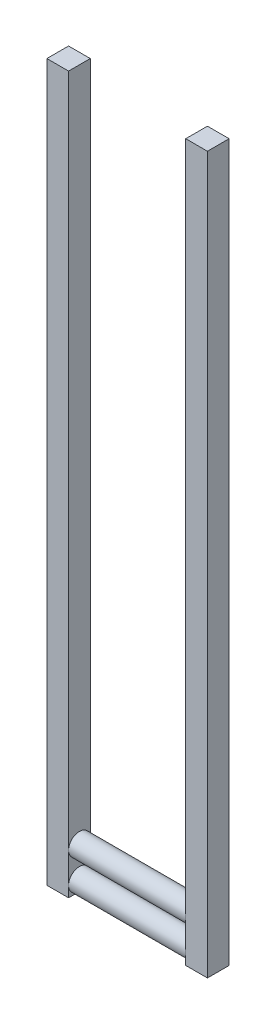
ISO-10303-21;
HEADER;
FILE_DESCRIPTION(('STEP AP214'),'2;1');
FILE_NAME('part.step','',(''),(''),'','','');
FILE_SCHEMA(('AUTOMOTIVE_DESIGN { 1 0 10303 214 1 1 1 1 }'));
ENDSEC;
DATA;
#1=APPLICATION_CONTEXT('core data for automotive mechanical design processes');
#2=APPLICATION_PROTOCOL_DEFINITION('international standard','automotive_design',2000,#1);
#3=PRODUCT_CONTEXT('',#1,'mechanical');
#4=PRODUCT('Part','Part','',(#3));
#5=PRODUCT_RELATED_PRODUCT_CATEGORY('part','',(#4));
#6=PRODUCT_DEFINITION_FORMATION('','',#4);
#7=PRODUCT_DEFINITION_CONTEXT('part definition',#1,'design');
#8=PRODUCT_DEFINITION('design','',#6,#7);
#9=PRODUCT_DEFINITION_SHAPE('','',#8);
#10=(LENGTH_UNIT() NAMED_UNIT(*) SI_UNIT(.MILLI.,.METRE.));
#11=(NAMED_UNIT(*) PLANE_ANGLE_UNIT() SI_UNIT($,.RADIAN.));
#12=(NAMED_UNIT(*) SI_UNIT($,.STERADIAN.) SOLID_ANGLE_UNIT());
#13=UNCERTAINTY_MEASURE_WITH_UNIT(LENGTH_MEASURE(1.E-05),#10,'distance_accuracy_value','');
#14=(GEOMETRIC_REPRESENTATION_CONTEXT(3) GLOBAL_UNCERTAINTY_ASSIGNED_CONTEXT((#13)) GLOBAL_UNIT_ASSIGNED_CONTEXT((#10,
#11,#12)) REPRESENTATION_CONTEXT('',''));
#15=CARTESIAN_POINT('',(0.,0.,0.));
#16=DIRECTION('',(0.,0.,1.));
#17=DIRECTION('',(1.,0.,0.));
#18=AXIS2_PLACEMENT_3D('',#15,#16,#17);
#19=CARTESIAN_POINT('',(-15.5357142857143,-165.,0.));
#20=DIRECTION('',(1.,0.,0.));
#21=DIRECTION('',(0.,0.,-1.));
#22=AXIS2_PLACEMENT_3D('',#19,#20,#21);
#23=PLANE('',#22);
#24=DIRECTION('',(0.,1.,0.));
#25=VECTOR('',#24,1.);
#26=CARTESIAN_POINT('',(-15.5357142857143,-165.,-5.));
#27=LINE('',#26,#25);
#28=CARTESIAN_POINT('',(-15.5357142857143,-162.5,-5.));
#29=VERTEX_POINT('',#28);
#30=CARTESIAN_POINT('',(-15.5357142857143,-155.5,-5.));
#31=VERTEX_POINT('',#30);
#32=EDGE_CURVE('E221',#29,#31,#27,.T.);
#33=ORIENTED_EDGE('',*,*,#32,.T.);
#34=CARTESIAN_POINT('',(-15.5357142857143,-155.5,-2.5));
#35=DIRECTION('',(1.,0.,0.));
#36=DIRECTION('',(0.,0.,-1.));
#37=AXIS2_PLACEMENT_3D('',#34,#35,#36);
#38=CIRCLE('',#37,2.5);
#39=CARTESIAN_POINT('',(-15.5357142857143,-155.5,0.));
#40=VERTEX_POINT('',#39);
#41=EDGE_CURVE('E55',#40,#31,#38,.T.);
#42=ORIENTED_EDGE('',*,*,#41,.F.);
#43=DIRECTION('',(0.,1.,0.));
#44=VECTOR('',#43,1.);
#45=CARTESIAN_POINT('',(-15.5357142857143,-165.,0.));
#46=LINE('',#45,#44);
#47=CARTESIAN_POINT('',(-15.5357142857143,-162.5,0.));
#48=VERTEX_POINT('',#47);
#49=EDGE_CURVE('E225',#48,#40,#46,.T.);
#50=ORIENTED_EDGE('',*,*,#49,.F.);
#51=CARTESIAN_POINT('',(-15.5357142857143,-162.5,-2.5));
#52=DIRECTION('',(1.,0.,0.));
#53=DIRECTION('',(0.,0.,-1.));
#54=AXIS2_PLACEMENT_3D('',#51,#52,#53);
#55=CIRCLE('',#54,2.5);
#56=EDGE_CURVE('E49',#29,#48,#55,.T.);
#57=ORIENTED_EDGE('',*,*,#56,.F.);
#58=EDGE_LOOP('',(#33,#42,#50,#57));
#59=FACE_BOUND('',#58,.T.);
#60=ADVANCED_FACE('F38',(#59),#23,.T.);
#61=CARTESIAN_POINT('',(11.4642857142857,-165.,0.));
#62=DIRECTION('',(-1.,0.,0.));
#63=DIRECTION('',(0.,0.,1.));
#64=AXIS2_PLACEMENT_3D('',#61,#62,#63);
#65=PLANE('',#64);
#66=DIRECTION('',(0.,1.,0.));
#67=VECTOR('',#66,1.);
#68=CARTESIAN_POINT('',(11.4642857142857,-165.,0.));
#69=LINE('',#68,#67);
#70=CARTESIAN_POINT('',(11.4642857142857,-162.5,0.));
#71=VERTEX_POINT('',#70);
#72=CARTESIAN_POINT('',(11.4642857142857,-155.5,0.));
#73=VERTEX_POINT('',#72);
#74=EDGE_CURVE('E148',#71,#73,#69,.T.);
#75=ORIENTED_EDGE('',*,*,#74,.T.);
#76=CARTESIAN_POINT('',(11.4642857142857,-155.5,-2.49999999999999));
#77=DIRECTION('',(1.,0.,0.));
#78=DIRECTION('',(0.,0.,-1.));
#79=AXIS2_PLACEMENT_3D('',#76,#77,#78);
#80=CIRCLE('',#79,2.5);
#81=CARTESIAN_POINT('',(11.4642857142857,-155.5,-5.));
#82=VERTEX_POINT('',#81);
#83=EDGE_CURVE('E62',#73,#82,#80,.T.);
#84=ORIENTED_EDGE('',*,*,#83,.T.);
#85=DIRECTION('',(0.,1.,0.));
#86=VECTOR('',#85,1.);
#87=CARTESIAN_POINT('',(11.4642857142857,-165.,-5.));
#88=LINE('',#87,#86);
#89=CARTESIAN_POINT('',(11.4642857142857,-162.5,-5.));
#90=VERTEX_POINT('',#89);
#91=EDGE_CURVE('E145',#90,#82,#88,.T.);
#92=ORIENTED_EDGE('',*,*,#91,.F.);
#93=CARTESIAN_POINT('',(11.4642857142857,-162.5,-2.49999999999999));
#94=DIRECTION('',(1.,0.,0.));
#95=DIRECTION('',(0.,0.,-1.));
#96=AXIS2_PLACEMENT_3D('',#93,#94,#95);
#97=CIRCLE('',#96,2.5);
#98=EDGE_CURVE('E188',#90,#71,#97,.T.);
#99=ORIENTED_EDGE('',*,*,#98,.T.);
#100=EDGE_LOOP('',(#75,#84,#92,#99));
#101=FACE_BOUND('',#100,.T.);
#102=ADVANCED_FACE('F142',(#101),#65,.T.);
#103=CARTESIAN_POINT('',(-15.5357142857143,0.,0.));
#104=VERTEX_POINT('',#103);
#105=EDGE_CURVE('E226',#40,#104,#46,.T.);
#106=ORIENTED_EDGE('',*,*,#105,.F.);
#107=EDGE_CURVE('E157',#31,#40,#38,.T.);
#108=ORIENTED_EDGE('',*,*,#107,.F.);
#109=CARTESIAN_POINT('',(-15.5357142857143,0.,-5.));
#110=VERTEX_POINT('',#109);
#111=EDGE_CURVE('E222',#31,#110,#27,.T.);
#112=ORIENTED_EDGE('',*,*,#111,.T.);
#113=DIRECTION('',(0.,0.,-1.));
#114=VECTOR('',#113,1.);
#115=CARTESIAN_POINT('',(-15.5357142857143,0.,0.));
#116=LINE('',#115,#114);
#117=EDGE_CURVE('E213',#104,#110,#116,.T.);
#118=ORIENTED_EDGE('',*,*,#117,.F.);
#119=EDGE_LOOP('',(#106,#108,#112,#118));
#120=FACE_BOUND('',#119,.T.);
#121=ADVANCED_FACE('F261',(#120),#23,.T.);
#122=CARTESIAN_POINT('',(-15.5357142857143,-165.,-2.5));
#123=VERTEX_POINT('',#122);
#124=EDGE_CURVE('E11',#48,#123,#55,.T.);
#125=ORIENTED_EDGE('',*,*,#124,.F.);
#126=CARTESIAN_POINT('',(-15.5357142857143,-165.,0.));
#127=VERTEX_POINT('',#126);
#128=EDGE_CURVE('E223',#127,#48,#46,.T.);
#129=ORIENTED_EDGE('',*,*,#128,.F.);
#130=DIRECTION('',(0.,0.,-1.));
#131=VECTOR('',#130,1.);
#132=CARTESIAN_POINT('',(-15.5357142857143,-165.,0.));
#133=LINE('',#132,#131);
#134=EDGE_CURVE('E202',#127,#123,#133,.T.);
#135=ORIENTED_EDGE('',*,*,#134,.T.);
#136=EDGE_LOOP('',(#125,#129,#135));
#137=FACE_BOUND('',#136,.T.);
#138=ADVANCED_FACE('F252',(#137),#23,.T.);
#139=CARTESIAN_POINT('',(-20.5357142857143,-165.,0.));
#140=DIRECTION('',(-1.,0.,0.));
#141=DIRECTION('',(0.,0.,1.));
#142=AXIS2_PLACEMENT_3D('',#139,#140,#141);
#143=PLANE('',#142);
#144=DIRECTION('',(0.,0.,1.));
#145=VECTOR('',#144,1.);
#146=CARTESIAN_POINT('',(-20.5357142857143,0.,0.));
#147=LINE('',#146,#145);
#148=CARTESIAN_POINT('',(-20.5357142857143,0.,-5.));
#149=VERTEX_POINT('',#148);
#150=CARTESIAN_POINT('',(-20.5357142857143,0.,0.));
#151=VERTEX_POINT('',#150);
#152=EDGE_CURVE('E189',#149,#151,#147,.T.);
#153=ORIENTED_EDGE('',*,*,#152,.F.);
#154=DIRECTION('',(0.,1.,0.));
#155=VECTOR('',#154,1.);
#156=CARTESIAN_POINT('',(-20.5357142857143,-165.,-5.));
#157=LINE('',#156,#155);
#158=CARTESIAN_POINT('',(-20.5357142857143,-165.,-5.));
#159=VERTEX_POINT('',#158);
#160=EDGE_CURVE('E218',#159,#149,#157,.T.);
#161=ORIENTED_EDGE('',*,*,#160,.F.);
#162=DIRECTION('',(0.,0.,1.));
#163=VECTOR('',#162,1.);
#164=CARTESIAN_POINT('',(-20.5357142857143,-165.,0.));
#165=LINE('',#164,#163);
#166=CARTESIAN_POINT('',(-20.5357142857143,-165.,0.));
#167=VERTEX_POINT('',#166);
#168=EDGE_CURVE('E194',#159,#167,#165,.T.);
#169=ORIENTED_EDGE('',*,*,#168,.T.);
#170=DIRECTION('',(0.,1.,0.));
#171=VECTOR('',#170,1.);
#172=CARTESIAN_POINT('',(-20.5357142857143,-165.,0.));
#173=LINE('',#172,#171);
#174=EDGE_CURVE('E42',#167,#151,#173,.T.);
#175=ORIENTED_EDGE('',*,*,#174,.T.);
#176=EDGE_LOOP('',(#153,#161,#169,#175));
#177=FACE_BOUND('',#176,.T.);
#178=ADVANCED_FACE('F40',(#177),#143,.T.);
#179=CARTESIAN_POINT('',(-20.5357142857143,-165.,-5.));
#180=DIRECTION('',(0.,0.,-1.));
#181=DIRECTION('',(-1.,0.,0.));
#182=AXIS2_PLACEMENT_3D('',#179,#180,#181);
#183=PLANE('',#182);
#184=DIRECTION('',(-1.,0.,0.));
#185=VECTOR('',#184,1.);
#186=CARTESIAN_POINT('',(-20.5357142857143,0.,-5.));
#187=LINE('',#186,#185);
#188=EDGE_CURVE('E198',#110,#149,#187,.T.);
#189=ORIENTED_EDGE('',*,*,#188,.F.);
#190=ORIENTED_EDGE('',*,*,#111,.F.);
#191=ORIENTED_EDGE('',*,*,#32,.F.);
#192=CARTESIAN_POINT('',(-15.5357142857143,-165.,-5.));
#193=VERTEX_POINT('',#192);
#194=EDGE_CURVE('E220',#193,#29,#27,.T.);
#195=ORIENTED_EDGE('',*,*,#194,.F.);
#196=DIRECTION('',(-1.,0.,0.));
#197=VECTOR('',#196,1.);
#198=CARTESIAN_POINT('',(-20.5357142857143,-165.,-5.));
#199=LINE('',#198,#197);
#200=EDGE_CURVE('E205',#193,#159,#199,.T.);
#201=ORIENTED_EDGE('',*,*,#200,.T.);
#202=ORIENTED_EDGE('',*,*,#160,.T.);
#203=EDGE_LOOP('',(#189,#190,#191,#195,#201,#202));
#204=FACE_BOUND('',#203,.T.);
#205=ADVANCED_FACE('F242',(#204),#183,.T.);
#206=EDGE_CURVE('E47',#123,#29,#55,.T.);
#207=ORIENTED_EDGE('',*,*,#206,.F.);
#208=EDGE_CURVE('E201',#123,#193,#133,.T.);
#209=ORIENTED_EDGE('',*,*,#208,.T.);
#210=ORIENTED_EDGE('',*,*,#194,.T.);
#211=EDGE_LOOP('',(#207,#209,#210));
#212=FACE_BOUND('',#211,.T.);
#213=ADVANCED_FACE('F301',(#212),#23,.T.);
#214=CARTESIAN_POINT('',(-20.5357142857143,-165.,0.));
#215=DIRECTION('',(0.,0.,1.));
#216=DIRECTION('',(1.,0.,0.));
#217=AXIS2_PLACEMENT_3D('',#214,#215,#216);
#218=PLANE('',#217);
#219=DIRECTION('',(1.,0.,0.));
#220=VECTOR('',#219,1.);
#221=CARTESIAN_POINT('',(-20.5357142857143,0.,0.));
#222=LINE('',#221,#220);
#223=EDGE_CURVE('E210',#151,#104,#222,.T.);
#224=ORIENTED_EDGE('',*,*,#223,.F.);
#225=ORIENTED_EDGE('',*,*,#174,.F.);
#226=DIRECTION('',(1.,0.,0.));
#227=VECTOR('',#226,1.);
#228=CARTESIAN_POINT('',(-20.5357142857143,-165.,0.));
#229=LINE('',#228,#227);
#230=EDGE_CURVE('E197',#167,#127,#229,.T.);
#231=ORIENTED_EDGE('',*,*,#230,.T.);
#232=ORIENTED_EDGE('',*,*,#128,.T.);
#233=ORIENTED_EDGE('',*,*,#49,.T.);
#234=ORIENTED_EDGE('',*,*,#105,.T.);
#235=EDGE_LOOP('',(#224,#225,#231,#232,#233,#234));
#236=FACE_BOUND('',#235,.T.);
#237=ADVANCED_FACE('F236',(#236),#218,.T.);
#238=CARTESIAN_POINT('',(0.,-165.,0.));
#239=DIRECTION('',(0.,-1.,0.));
#240=DIRECTION('',(0.,0.,-1.));
#241=AXIS2_PLACEMENT_3D('',#238,#239,#240);
#242=PLANE('',#241);
#243=ORIENTED_EDGE('',*,*,#168,.F.);
#244=ORIENTED_EDGE('',*,*,#200,.F.);
#245=ORIENTED_EDGE('',*,*,#208,.F.);
#246=ORIENTED_EDGE('',*,*,#134,.F.);
#247=ORIENTED_EDGE('',*,*,#230,.F.);
#248=EDGE_LOOP('',(#243,#244,#245,#246,#247));
#249=FACE_BOUND('',#248,.T.);
#250=ADVANCED_FACE('F248',(#249),#242,.T.);
#251=CARTESIAN_POINT('',(0.,0.,0.));
#252=DIRECTION('',(0.,-1.,0.));
#253=DIRECTION('',(0.,0.,-1.));
#254=AXIS2_PLACEMENT_3D('',#251,#252,#253);
#255=PLANE('',#254);
#256=ORIENTED_EDGE('',*,*,#152,.T.);
#257=ORIENTED_EDGE('',*,*,#223,.T.);
#258=ORIENTED_EDGE('',*,*,#117,.T.);
#259=ORIENTED_EDGE('',*,*,#188,.T.);
#260=EDGE_LOOP('',(#256,#257,#258,#259));
#261=FACE_BOUND('',#260,.T.);
#262=ADVANCED_FACE('F238',(#261),#255,.F.);
#263=CARTESIAN_POINT('',(11.4642857142857,-162.5,-2.49999999999999));
#264=DIRECTION('',(-1.,0.,0.));
#265=DIRECTION('',(0.,0.,1.));
#266=AXIS2_PLACEMENT_3D('',#263,#264,#265);
#267=CYLINDRICAL_SURFACE('',#266,2.5);
#268=ORIENTED_EDGE('',*,*,#98,.F.);
#269=CARTESIAN_POINT('',(11.4642857142857,-165.,-2.49999999999999));
#270=VERTEX_POINT('',#269);
#271=EDGE_CURVE('E191',#270,#90,#97,.T.);
#272=ORIENTED_EDGE('',*,*,#271,.F.);
#273=EDGE_CURVE('E190',#71,#270,#97,.T.);
#274=ORIENTED_EDGE('',*,*,#273,.F.);
#275=EDGE_LOOP('',(#268,#272,#274));
#276=FACE_BOUND('',#275,.T.);
#277=ORIENTED_EDGE('',*,*,#56,.T.);
#278=ORIENTED_EDGE('',*,*,#124,.T.);
#279=ORIENTED_EDGE('',*,*,#206,.T.);
#280=EDGE_LOOP('',(#277,#278,#279));
#281=FACE_BOUND('',#280,.T.);
#282=ADVANCED_FACE('F256',(#276,#281),#267,.T.);
#283=CARTESIAN_POINT('',(11.4642857142857,0.,-5.));
#284=VERTEX_POINT('',#283);
#285=EDGE_CURVE('E150',#82,#284,#88,.T.);
#286=ORIENTED_EDGE('',*,*,#285,.F.);
#287=EDGE_CURVE('E133',#82,#73,#80,.T.);
#288=ORIENTED_EDGE('',*,*,#287,.T.);
#289=CARTESIAN_POINT('',(11.4642857142857,0.,0.));
#290=VERTEX_POINT('',#289);
#291=EDGE_CURVE('E264',#73,#290,#69,.T.);
#292=ORIENTED_EDGE('',*,*,#291,.T.);
#293=DIRECTION('',(0.,0.,1.));
#294=VECTOR('',#293,1.);
#295=CARTESIAN_POINT('',(11.4642857142857,0.,0.));
#296=LINE('',#295,#294);
#297=EDGE_CURVE('E153',#284,#290,#296,.T.);
#298=ORIENTED_EDGE('',*,*,#297,.F.);
#299=EDGE_LOOP('',(#286,#288,#292,#298));
#300=FACE_BOUND('',#299,.T.);
#301=ADVANCED_FACE('F151',(#300),#65,.T.);
#302=CARTESIAN_POINT('',(11.4642857142857,-165.,0.));
#303=VERTEX_POINT('',#302);
#304=EDGE_CURVE('E179',#303,#71,#69,.T.);
#305=ORIENTED_EDGE('',*,*,#304,.T.);
#306=ORIENTED_EDGE('',*,*,#273,.T.);
#307=DIRECTION('',(0.,0.,1.));
#308=VECTOR('',#307,1.);
#309=CARTESIAN_POINT('',(11.4642857142857,-165.,0.));
#310=LINE('',#309,#308);
#311=EDGE_CURVE('E185',#270,#303,#310,.T.);
#312=ORIENTED_EDGE('',*,*,#311,.T.);
#313=EDGE_LOOP('',(#305,#306,#312));
#314=FACE_BOUND('',#313,.T.);
#315=ADVANCED_FACE('F280',(#314),#65,.T.);
#316=CARTESIAN_POINT('',(11.4642857142857,-165.,-5.));
#317=VERTEX_POINT('',#316);
#318=EDGE_CURVE('E169',#317,#270,#310,.T.);
#319=ORIENTED_EDGE('',*,*,#318,.T.);
#320=ORIENTED_EDGE('',*,*,#271,.T.);
#321=EDGE_CURVE('E159',#317,#90,#88,.T.);
#322=ORIENTED_EDGE('',*,*,#321,.F.);
#323=EDGE_LOOP('',(#319,#320,#322));
#324=FACE_BOUND('',#323,.T.);
#325=ADVANCED_FACE('F287',(#324),#65,.T.);
#326=CARTESIAN_POINT('',(11.4642857142857,-165.,-5.));
#327=DIRECTION('',(0.,0.,-1.));
#328=DIRECTION('',(-1.,0.,0.));
#329=AXIS2_PLACEMENT_3D('',#326,#327,#328);
#330=PLANE('',#329);
#331=DIRECTION('',(-1.,0.,0.));
#332=VECTOR('',#331,1.);
#333=CARTESIAN_POINT('',(11.4642857142857,0.,-5.));
#334=LINE('',#333,#332);
#335=CARTESIAN_POINT('',(16.4642857142857,0.,-5.));
#336=VERTEX_POINT('',#335);
#337=EDGE_CURVE('E166',#336,#284,#334,.T.);
#338=ORIENTED_EDGE('',*,*,#337,.F.);
#339=DIRECTION('',(0.,1.,0.));
#340=VECTOR('',#339,1.);
#341=CARTESIAN_POINT('',(16.4642857142857,-165.,-5.));
#342=LINE('',#341,#340);
#343=CARTESIAN_POINT('',(16.4642857142857,-165.,-5.));
#344=VERTEX_POINT('',#343);
#345=EDGE_CURVE('E162',#344,#336,#342,.T.);
#346=ORIENTED_EDGE('',*,*,#345,.F.);
#347=DIRECTION('',(-1.,0.,0.));
#348=VECTOR('',#347,1.);
#349=CARTESIAN_POINT('',(11.4642857142857,-165.,-5.));
#350=LINE('',#349,#348);
#351=EDGE_CURVE('E176',#344,#317,#350,.T.);
#352=ORIENTED_EDGE('',*,*,#351,.T.);
#353=ORIENTED_EDGE('',*,*,#321,.T.);
#354=ORIENTED_EDGE('',*,*,#91,.T.);
#355=ORIENTED_EDGE('',*,*,#285,.T.);
#356=EDGE_LOOP('',(#338,#346,#352,#353,#354,#355));
#357=FACE_BOUND('',#356,.T.);
#358=ADVANCED_FACE('F160',(#357),#330,.T.);
#359=CARTESIAN_POINT('',(16.4642857142857,-165.,0.));
#360=DIRECTION('',(1.,0.,0.));
#361=DIRECTION('',(0.,0.,-1.));
#362=AXIS2_PLACEMENT_3D('',#359,#360,#361);
#363=PLANE('',#362);
#364=DIRECTION('',(0.,0.,-1.));
#365=VECTOR('',#364,1.);
#366=CARTESIAN_POINT('',(16.4642857142857,0.,0.));
#367=LINE('',#366,#365);
#368=CARTESIAN_POINT('',(16.4642857142857,0.,0.));
#369=VERTEX_POINT('',#368);
#370=EDGE_CURVE('E168',#369,#336,#367,.T.);
#371=ORIENTED_EDGE('',*,*,#370,.F.);
#372=DIRECTION('',(0.,1.,0.));
#373=VECTOR('',#372,1.);
#374=CARTESIAN_POINT('',(16.4642857142857,-165.,0.));
#375=LINE('',#374,#373);
#376=CARTESIAN_POINT('',(16.4642857142857,-165.,0.));
#377=VERTEX_POINT('',#376);
#378=EDGE_CURVE('E265',#377,#369,#375,.T.);
#379=ORIENTED_EDGE('',*,*,#378,.F.);
#380=DIRECTION('',(0.,0.,-1.));
#381=VECTOR('',#380,1.);
#382=CARTESIAN_POINT('',(16.4642857142857,-165.,0.));
#383=LINE('',#382,#381);
#384=EDGE_CURVE('E178',#377,#344,#383,.T.);
#385=ORIENTED_EDGE('',*,*,#384,.T.);
#386=ORIENTED_EDGE('',*,*,#345,.T.);
#387=EDGE_LOOP('',(#371,#379,#385,#386));
#388=FACE_BOUND('',#387,.T.);
#389=ADVANCED_FACE('F270',(#388),#363,.T.);
#390=CARTESIAN_POINT('',(11.4642857142857,-165.,0.));
#391=DIRECTION('',(0.,0.,1.));
#392=DIRECTION('',(1.,0.,0.));
#393=AXIS2_PLACEMENT_3D('',#390,#391,#392);
#394=PLANE('',#393);
#395=DIRECTION('',(1.,0.,0.));
#396=VECTOR('',#395,1.);
#397=CARTESIAN_POINT('',(11.4642857142857,0.,0.));
#398=LINE('',#397,#396);
#399=EDGE_CURVE('E172',#290,#369,#398,.T.);
#400=ORIENTED_EDGE('',*,*,#399,.F.);
#401=ORIENTED_EDGE('',*,*,#291,.F.);
#402=ORIENTED_EDGE('',*,*,#74,.F.);
#403=ORIENTED_EDGE('',*,*,#304,.F.);
#404=DIRECTION('',(1.,0.,0.));
#405=VECTOR('',#404,1.);
#406=CARTESIAN_POINT('',(11.4642857142857,-165.,0.));
#407=LINE('',#406,#405);
#408=EDGE_CURVE('E182',#303,#377,#407,.T.);
#409=ORIENTED_EDGE('',*,*,#408,.T.);
#410=ORIENTED_EDGE('',*,*,#378,.T.);
#411=EDGE_LOOP('',(#400,#401,#402,#403,#409,#410));
#412=FACE_BOUND('',#411,.T.);
#413=ADVANCED_FACE('F275',(#412),#394,.T.);
#414=CARTESIAN_POINT('',(0.,-165.,0.));
#415=DIRECTION('',(0.,-1.,0.));
#416=DIRECTION('',(0.,0.,-1.));
#417=AXIS2_PLACEMENT_3D('',#414,#415,#416);
#418=PLANE('',#417);
#419=ORIENTED_EDGE('',*,*,#318,.F.);
#420=ORIENTED_EDGE('',*,*,#351,.F.);
#421=ORIENTED_EDGE('',*,*,#384,.F.);
#422=ORIENTED_EDGE('',*,*,#408,.F.);
#423=ORIENTED_EDGE('',*,*,#311,.F.);
#424=EDGE_LOOP('',(#419,#420,#421,#422,#423));
#425=FACE_BOUND('',#424,.T.);
#426=ADVANCED_FACE('F284',(#425),#418,.T.);
#427=CARTESIAN_POINT('',(0.,0.,0.));
#428=DIRECTION('',(0.,-1.,0.));
#429=DIRECTION('',(0.,0.,-1.));
#430=AXIS2_PLACEMENT_3D('',#427,#428,#429);
#431=PLANE('',#430);
#432=ORIENTED_EDGE('',*,*,#297,.T.);
#433=ORIENTED_EDGE('',*,*,#399,.T.);
#434=ORIENTED_EDGE('',*,*,#370,.T.);
#435=ORIENTED_EDGE('',*,*,#337,.T.);
#436=EDGE_LOOP('',(#432,#433,#434,#435));
#437=FACE_BOUND('',#436,.T.);
#438=ADVANCED_FACE('F274',(#437),#431,.F.);
#439=CARTESIAN_POINT('',(11.4642857142857,-155.5,-2.49999999999999));
#440=DIRECTION('',(-1.,0.,0.));
#441=DIRECTION('',(0.,0.,1.));
#442=AXIS2_PLACEMENT_3D('',#439,#440,#441);
#443=CYLINDRICAL_SURFACE('',#442,2.5);
#444=ORIENTED_EDGE('',*,*,#287,.F.);
#445=ORIENTED_EDGE('',*,*,#83,.F.);
#446=EDGE_LOOP('',(#444,#445));
#447=FACE_BOUND('',#446,.T.);
#448=ORIENTED_EDGE('',*,*,#107,.T.);
#449=ORIENTED_EDGE('',*,*,#41,.T.);
#450=EDGE_LOOP('',(#448,#449));
#451=FACE_BOUND('',#450,.T.);
#452=ADVANCED_FACE('F134',(#447,#451),#443,.T.);
#453=CLOSED_SHELL('',(#60,#102,#121,#138,#178,#205,#213,#237,#250,#262,#282,#301,#315,#325,#358,
#389,#413,#426,#438,#452));
#454=MANIFOLD_SOLID_BREP('B2',#453);
#455=ADVANCED_BREP_SHAPE_REPRESENTATION('',(#18,#454),#14);
#456=SHAPE_DEFINITION_REPRESENTATION(#9,#455);
ENDSEC;
END-ISO-10303-21;
